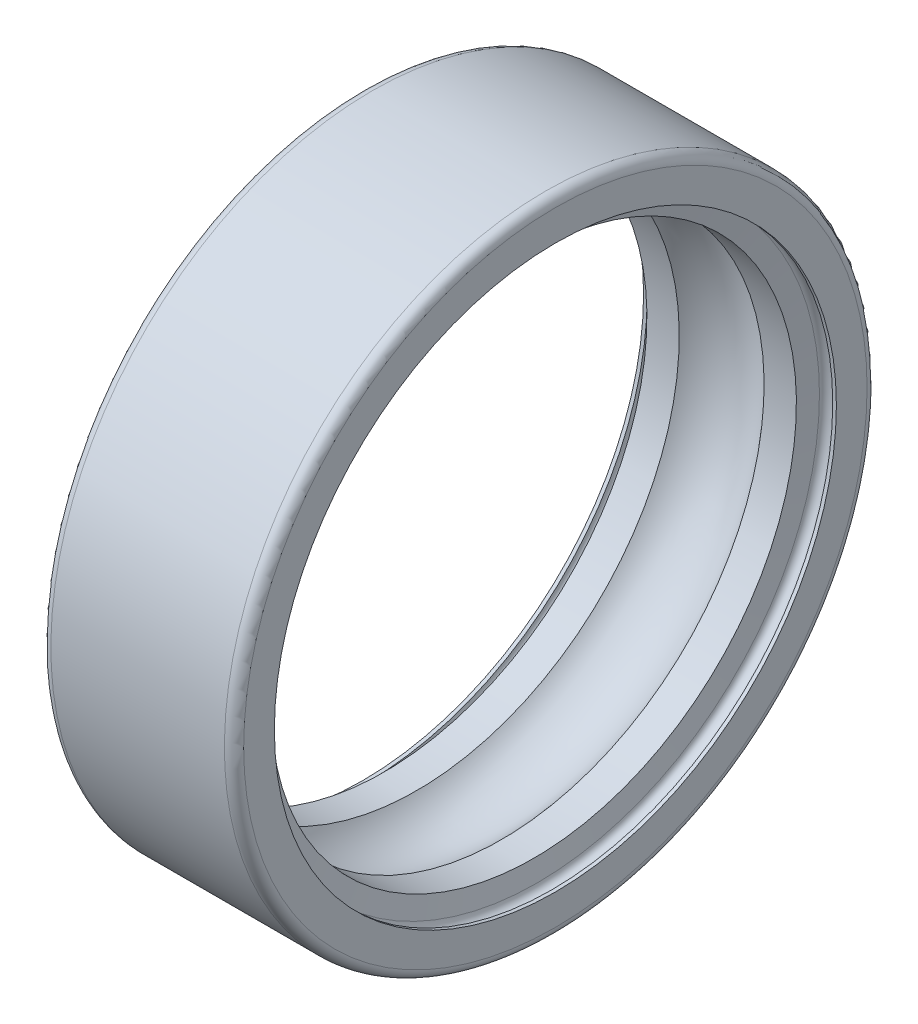
ISO-10303-21;
HEADER;
FILE_DESCRIPTION(('STEP AP214'),'2;1');
FILE_NAME('part.step','',(''),(''),'','','');
FILE_SCHEMA(('AUTOMOTIVE_DESIGN { 1 0 10303 214 1 1 1 1 }'));
ENDSEC;
DATA;
#1=APPLICATION_CONTEXT('core data for automotive mechanical design processes');
#2=APPLICATION_PROTOCOL_DEFINITION('international standard','automotive_design',2000,#1);
#3=PRODUCT_CONTEXT('',#1,'mechanical');
#4=PRODUCT('Part','Part','',(#3));
#5=PRODUCT_RELATED_PRODUCT_CATEGORY('part','',(#4));
#6=PRODUCT_DEFINITION_FORMATION('','',#4);
#7=PRODUCT_DEFINITION_CONTEXT('part definition',#1,'design');
#8=PRODUCT_DEFINITION('design','',#6,#7);
#9=PRODUCT_DEFINITION_SHAPE('','',#8);
#10=(LENGTH_UNIT() NAMED_UNIT(*) SI_UNIT(.MILLI.,.METRE.));
#11=(NAMED_UNIT(*) PLANE_ANGLE_UNIT() SI_UNIT($,.RADIAN.));
#12=(NAMED_UNIT(*) SI_UNIT($,.STERADIAN.) SOLID_ANGLE_UNIT());
#13=UNCERTAINTY_MEASURE_WITH_UNIT(LENGTH_MEASURE(1.E-05),#10,'distance_accuracy_value','');
#14=(GEOMETRIC_REPRESENTATION_CONTEXT(3) GLOBAL_UNCERTAINTY_ASSIGNED_CONTEXT((#13)) GLOBAL_UNIT_ASSIGNED_CONTEXT((#10,
#11,#12)) REPRESENTATION_CONTEXT('',''));
#15=CARTESIAN_POINT('',(0.,0.,0.));
#16=DIRECTION('',(0.,0.,1.));
#17=DIRECTION('',(1.,0.,0.));
#18=AXIS2_PLACEMENT_3D('',#15,#16,#17);
#19=CARTESIAN_POINT('',(11.316,0.,0.));
#20=DIRECTION('',(1.,0.,0.));
#21=DIRECTION('',(0.,0.,-1.));
#22=AXIS2_PLACEMENT_3D('',#19,#20,#21);
#23=TOROIDAL_SURFACE('',#22,17.49,0.456);
#24=CARTESIAN_POINT('',(11.772,0.,0.));
#25=DIRECTION('',(1.,0.,0.));
#26=DIRECTION('',(0.,1.,0.));
#27=AXIS2_PLACEMENT_3D('',#24,#25,#26);
#28=CIRCLE('',#27,17.49);
#29=CARTESIAN_POINT('',(11.772,17.49,0.));
#30=VERTEX_POINT('',#29);
#31=EDGE_CURVE('E11',#30,#30,#28,.T.);
#32=ORIENTED_EDGE('',*,*,#31,.T.);
#33=EDGE_LOOP('',(#32));
#34=FACE_BOUND('',#33,.T.);
#35=CARTESIAN_POINT('',(10.8669276646264,0.,0.));
#36=DIRECTION('',(1.,0.,0.));
#37=DIRECTION('',(0.,1.,0.));
#38=AXIS2_PLACEMENT_3D('',#35,#36,#37);
#39=CIRCLE('',#38,17.5691835690161);
#40=CARTESIAN_POINT('',(10.8669276646264,17.5691835690161,0.));
#41=VERTEX_POINT('',#40);
#42=EDGE_CURVE('E90',#41,#41,#39,.T.);
#43=ORIENTED_EDGE('',*,*,#42,.F.);
#44=EDGE_LOOP('',(#43));
#45=FACE_BOUND('',#44,.T.);
#46=ADVANCED_FACE('F17',(#34,#45),#23,.F.);
#47=CARTESIAN_POINT('',(11.886,0.,0.));
#48=DIRECTION('',(-1.,0.,0.));
#49=DIRECTION('',(0.,1.,0.));
#50=AXIS2_PLACEMENT_3D('',#47,#48,#49);
#51=CYLINDRICAL_SURFACE('',#50,17.49);
#52=CARTESIAN_POINT('',(12.,0.,0.));
#53=DIRECTION('',(1.,0.,0.));
#54=DIRECTION('',(0.,1.,0.));
#55=AXIS2_PLACEMENT_3D('',#52,#53,#54);
#56=CIRCLE('',#55,17.49);
#57=CARTESIAN_POINT('',(12.,17.49,0.));
#58=VERTEX_POINT('',#57);
#59=EDGE_CURVE('E27',#58,#58,#56,.T.);
#60=ORIENTED_EDGE('',*,*,#59,.T.);
#61=EDGE_LOOP('',(#60));
#62=FACE_BOUND('',#61,.T.);
#63=ORIENTED_EDGE('',*,*,#31,.F.);
#64=EDGE_LOOP('',(#63));
#65=FACE_BOUND('',#64,.T.);
#66=ADVANCED_FACE('F125',(#62,#65),#51,.F.);
#67=CARTESIAN_POINT('',(12.,18.445,0.));
#68=DIRECTION('',(1.,0.,0.));
#69=DIRECTION('',(0.,1.,0.));
#70=AXIS2_PLACEMENT_3D('',#67,#68,#69);
#71=PLANE('',#70);
#72=CARTESIAN_POINT('',(12.,0.,0.));
#73=DIRECTION('',(1.,0.,0.));
#74=DIRECTION('',(0.,1.,0.));
#75=AXIS2_PLACEMENT_3D('',#72,#73,#74);
#76=CIRCLE('',#75,19.4);
#77=CARTESIAN_POINT('',(12.,19.4,0.));
#78=VERTEX_POINT('',#77);
#79=EDGE_CURVE('E88',#78,#78,#76,.T.);
#80=ORIENTED_EDGE('',*,*,#79,.T.);
#81=EDGE_LOOP('',(#80));
#82=FACE_BOUND('',#81,.T.);
#83=ORIENTED_EDGE('',*,*,#59,.F.);
#84=EDGE_LOOP('',(#83));
#85=FACE_BOUND('',#84,.T.);
#86=ADVANCED_FACE('F130',(#82,#85),#71,.T.);
#87=CARTESIAN_POINT('',(11.4,0.,0.));
#88=DIRECTION('',(1.,0.,0.));
#89=DIRECTION('',(0.,0.,-1.));
#90=AXIS2_PLACEMENT_3D('',#87,#88,#89);
#91=TOROIDAL_SURFACE('',#90,19.4,0.6);
#92=CARTESIAN_POINT('',(11.4,0.,0.));
#93=DIRECTION('',(1.,0.,0.));
#94=DIRECTION('',(0.,1.,0.));
#95=AXIS2_PLACEMENT_3D('',#92,#93,#94);
#96=CIRCLE('',#95,20.);
#97=CARTESIAN_POINT('',(11.4,20.,0.));
#98=VERTEX_POINT('',#97);
#99=EDGE_CURVE('E95',#98,#98,#96,.T.);
#100=ORIENTED_EDGE('',*,*,#99,.T.);
#101=EDGE_LOOP('',(#100));
#102=FACE_BOUND('',#101,.T.);
#103=ORIENTED_EDGE('',*,*,#79,.F.);
#104=EDGE_LOOP('',(#103));
#105=FACE_BOUND('',#104,.T.);
#106=ADVANCED_FACE('F135',(#102,#105),#91,.T.);
#107=CARTESIAN_POINT('',(6.,0.,0.));
#108=DIRECTION('',(-1.,0.,0.));
#109=DIRECTION('',(0.,1.,0.));
#110=AXIS2_PLACEMENT_3D('',#107,#108,#109);
#111=CYLINDRICAL_SURFACE('',#110,20.);
#112=CARTESIAN_POINT('',(0.6,0.,0.));
#113=DIRECTION('',(1.,0.,0.));
#114=DIRECTION('',(0.,1.,0.));
#115=AXIS2_PLACEMENT_3D('',#112,#113,#114);
#116=CIRCLE('',#115,20.);
#117=CARTESIAN_POINT('',(0.6,20.,0.));
#118=VERTEX_POINT('',#117);
#119=EDGE_CURVE('E93',#118,#118,#116,.T.);
#120=ORIENTED_EDGE('',*,*,#119,.T.);
#121=EDGE_LOOP('',(#120));
#122=FACE_BOUND('',#121,.T.);
#123=ORIENTED_EDGE('',*,*,#99,.F.);
#124=EDGE_LOOP('',(#123));
#125=FACE_BOUND('',#124,.T.);
#126=ADVANCED_FACE('F159',(#122,#125),#111,.T.);
#127=CARTESIAN_POINT('',(0.6,0.,0.));
#128=DIRECTION('',(1.,0.,0.));
#129=DIRECTION('',(0.,0.,-1.));
#130=AXIS2_PLACEMENT_3D('',#127,#128,#129);
#131=TOROIDAL_SURFACE('',#130,19.4,0.6);
#132=CARTESIAN_POINT('',(0.,0.,0.));
#133=DIRECTION('',(1.,0.,0.));
#134=DIRECTION('',(0.,1.,0.));
#135=AXIS2_PLACEMENT_3D('',#132,#133,#134);
#136=CIRCLE('',#135,19.4);
#137=CARTESIAN_POINT('',(0.,19.4,0.));
#138=VERTEX_POINT('',#137);
#139=EDGE_CURVE('E21',#138,#138,#136,.T.);
#140=ORIENTED_EDGE('',*,*,#139,.T.);
#141=EDGE_LOOP('',(#140));
#142=FACE_BOUND('',#141,.T.);
#143=ORIENTED_EDGE('',*,*,#119,.F.);
#144=EDGE_LOOP('',(#143));
#145=FACE_BOUND('',#144,.T.);
#146=ADVANCED_FACE('F155',(#142,#145),#131,.T.);
#147=CARTESIAN_POINT('',(0.,18.445,0.));
#148=DIRECTION('',(-1.,0.,0.));
#149=DIRECTION('',(0.,-1.,0.));
#150=AXIS2_PLACEMENT_3D('',#147,#148,#149);
#151=PLANE('',#150);
#152=CARTESIAN_POINT('',(0.,0.,0.));
#153=DIRECTION('',(1.,0.,0.));
#154=DIRECTION('',(0.,1.,0.));
#155=AXIS2_PLACEMENT_3D('',#152,#153,#154);
#156=CIRCLE('',#155,17.49);
#157=CARTESIAN_POINT('',(0.,17.49,0.));
#158=VERTEX_POINT('',#157);
#159=EDGE_CURVE('E59',#158,#158,#156,.T.);
#160=ORIENTED_EDGE('',*,*,#159,.T.);
#161=EDGE_LOOP('',(#160));
#162=FACE_BOUND('',#161,.T.);
#163=ORIENTED_EDGE('',*,*,#139,.F.);
#164=EDGE_LOOP('',(#163));
#165=FACE_BOUND('',#164,.T.);
#166=ADVANCED_FACE('F145',(#162,#165),#151,.T.);
#167=CARTESIAN_POINT('',(0.114,0.,0.));
#168=DIRECTION('',(-1.,0.,0.));
#169=DIRECTION('',(0.,1.,0.));
#170=AXIS2_PLACEMENT_3D('',#167,#168,#169);
#171=CYLINDRICAL_SURFACE('',#170,17.49);
#172=CARTESIAN_POINT('',(0.228,0.,0.));
#173=DIRECTION('',(1.,0.,0.));
#174=DIRECTION('',(0.,1.,0.));
#175=AXIS2_PLACEMENT_3D('',#172,#173,#174);
#176=CIRCLE('',#175,17.49);
#177=CARTESIAN_POINT('',(0.228,17.49,0.));
#178=VERTEX_POINT('',#177);
#179=EDGE_CURVE('E79',#178,#178,#176,.T.);
#180=ORIENTED_EDGE('',*,*,#179,.T.);
#181=EDGE_LOOP('',(#180));
#182=FACE_BOUND('',#181,.T.);
#183=ORIENTED_EDGE('',*,*,#159,.F.);
#184=EDGE_LOOP('',(#183));
#185=FACE_BOUND('',#184,.T.);
#186=ADVANCED_FACE('F139',(#182,#185),#171,.F.);
#187=CARTESIAN_POINT('',(0.684,0.,0.));
#188=DIRECTION('',(1.,0.,0.));
#189=DIRECTION('',(0.,0.,-1.));
#190=AXIS2_PLACEMENT_3D('',#187,#188,#189);
#191=TOROIDAL_SURFACE('',#190,17.49,0.456);
#192=CARTESIAN_POINT('',(1.13307233537356,0.,0.));
#193=DIRECTION('',(1.,0.,0.));
#194=DIRECTION('',(0.,1.,0.));
#195=AXIS2_PLACEMENT_3D('',#192,#193,#194);
#196=CIRCLE('',#195,17.5691835690161);
#197=CARTESIAN_POINT('',(1.13307233537356,17.5691835690161,0.));
#198=VERTEX_POINT('',#197);
#199=EDGE_CURVE('E76',#198,#198,#196,.T.);
#200=ORIENTED_EDGE('',*,*,#199,.T.);
#201=EDGE_LOOP('',(#200));
#202=FACE_BOUND('',#201,.T.);
#203=ORIENTED_EDGE('',*,*,#179,.F.);
#204=EDGE_LOOP('',(#203));
#205=FACE_BOUND('',#204,.T.);
#206=ADVANCED_FACE('F137',(#202,#205),#191,.F.);
#207=CARTESIAN_POINT('',(1.24055981420055,0.,0.));
#208=DIRECTION('',(-1.,0.,0.));
#209=DIRECTION('',(0.,1.,0.));
#210=AXIS2_PLACEMENT_3D('',#207,#208,#209);
#211=CONICAL_SURFACE('',#210,16.9595917845081,1.39626340159546);
#212=CARTESIAN_POINT('',(1.34804729302754,0.,0.));
#213=DIRECTION('',(1.,0.,0.));
#214=DIRECTION('',(0.,1.,0.));
#215=AXIS2_PLACEMENT_3D('',#212,#213,#214);
#216=CIRCLE('',#215,16.35);
#217=CARTESIAN_POINT('',(1.34804729302755,16.35,0.));
#218=VERTEX_POINT('',#217);
#219=EDGE_CURVE('E72',#218,#218,#216,.T.);
#220=ORIENTED_EDGE('',*,*,#219,.T.);
#221=EDGE_LOOP('',(#220));
#222=FACE_BOUND('',#221,.T.);
#223=ORIENTED_EDGE('',*,*,#199,.F.);
#224=EDGE_LOOP('',(#223));
#225=FACE_BOUND('',#224,.T.);
#226=ADVANCED_FACE('F73',(#222,#225),#211,.F.);
#227=CARTESIAN_POINT('',(2.35393820893785,0.,0.));
#228=DIRECTION('',(-1.,0.,0.));
#229=DIRECTION('',(0.,1.,0.));
#230=AXIS2_PLACEMENT_3D('',#227,#228,#229);
#231=CYLINDRICAL_SURFACE('',#230,16.35);
#232=CARTESIAN_POINT('',(3.35982912484817,0.,0.));
#233=DIRECTION('',(1.,0.,0.));
#234=DIRECTION('',(0.,1.,0.));
#235=AXIS2_PLACEMENT_3D('',#232,#233,#234);
#236=CIRCLE('',#235,16.35);
#237=CARTESIAN_POINT('',(3.35982912484817,16.35,0.));
#238=VERTEX_POINT('',#237);
#239=EDGE_CURVE('E77',#238,#238,#236,.T.);
#240=ORIENTED_EDGE('',*,*,#239,.T.);
#241=EDGE_LOOP('',(#240));
#242=FACE_BOUND('',#241,.T.);
#243=ORIENTED_EDGE('',*,*,#219,.F.);
#244=EDGE_LOOP('',(#243));
#245=FACE_BOUND('',#244,.T.);
#246=ADVANCED_FACE('F19',(#242,#245),#231,.F.);
#247=CARTESIAN_POINT('',(6.,0.,0.));
#248=DIRECTION('',(1.,0.,0.));
#249=DIRECTION('',(0.,0.,-1.));
#250=AXIS2_PLACEMENT_3D('',#247,#248,#249);
#251=TOROIDAL_SURFACE('',#250,14.25,3.3735);
#252=CARTESIAN_POINT('',(8.64017087515183,0.,0.));
#253=DIRECTION('',(1.,0.,0.));
#254=DIRECTION('',(0.,1.,0.));
#255=AXIS2_PLACEMENT_3D('',#252,#253,#254);
#256=CIRCLE('',#255,16.35);
#257=CARTESIAN_POINT('',(8.64017087515183,16.35,0.));
#258=VERTEX_POINT('',#257);
#259=EDGE_CURVE('E81',#258,#258,#256,.T.);
#260=ORIENTED_EDGE('',*,*,#259,.T.);
#261=EDGE_LOOP('',(#260));
#262=FACE_BOUND('',#261,.T.);
#263=ORIENTED_EDGE('',*,*,#239,.F.);
#264=EDGE_LOOP('',(#263));
#265=FACE_BOUND('',#264,.T.);
#266=ADVANCED_FACE('F107',(#262,#265),#251,.F.);
#267=CARTESIAN_POINT('',(9.64606179106214,0.,0.));
#268=DIRECTION('',(-1.,0.,0.));
#269=DIRECTION('',(0.,1.,0.));
#270=AXIS2_PLACEMENT_3D('',#267,#268,#269);
#271=CYLINDRICAL_SURFACE('',#270,16.35);
#272=CARTESIAN_POINT('',(10.6519527069724,0.,0.));
#273=DIRECTION('',(1.,0.,0.));
#274=DIRECTION('',(0.,1.,0.));
#275=AXIS2_PLACEMENT_3D('',#272,#273,#274);
#276=CIRCLE('',#275,16.35);
#277=CARTESIAN_POINT('',(10.6519527069724,16.35,0.));
#278=VERTEX_POINT('',#277);
#279=EDGE_CURVE('E89',#278,#278,#276,.T.);
#280=ORIENTED_EDGE('',*,*,#279,.T.);
#281=EDGE_LOOP('',(#280));
#282=FACE_BOUND('',#281,.T.);
#283=ORIENTED_EDGE('',*,*,#259,.F.);
#284=EDGE_LOOP('',(#283));
#285=FACE_BOUND('',#284,.T.);
#286=ADVANCED_FACE('F110',(#282,#285),#271,.F.);
#287=CARTESIAN_POINT('',(10.7594401857994,0.,0.));
#288=DIRECTION('',(1.,0.,0.));
#289=DIRECTION('',(0.,1.,0.));
#290=AXIS2_PLACEMENT_3D('',#287,#288,#289);
#291=CONICAL_SURFACE('',#290,16.9595917845081,1.39626340159546);
#292=ORIENTED_EDGE('',*,*,#42,.T.);
#293=EDGE_LOOP('',(#292));
#294=FACE_BOUND('',#293,.T.);
#295=ORIENTED_EDGE('',*,*,#279,.F.);
#296=EDGE_LOOP('',(#295));
#297=FACE_BOUND('',#296,.T.);
#298=ADVANCED_FACE('F112',(#294,#297),#291,.F.);
#299=CLOSED_SHELL('',(#46,#66,#86,#106,#126,#146,#166,#186,#206,#226,#246,#266,#286,#298));
#300=MANIFOLD_SOLID_BREP('B1',#299);
#301=ADVANCED_BREP_SHAPE_REPRESENTATION('',(#18,#300),#14);
#302=SHAPE_DEFINITION_REPRESENTATION(#9,#301);
ENDSEC;
END-ISO-10303-21;
